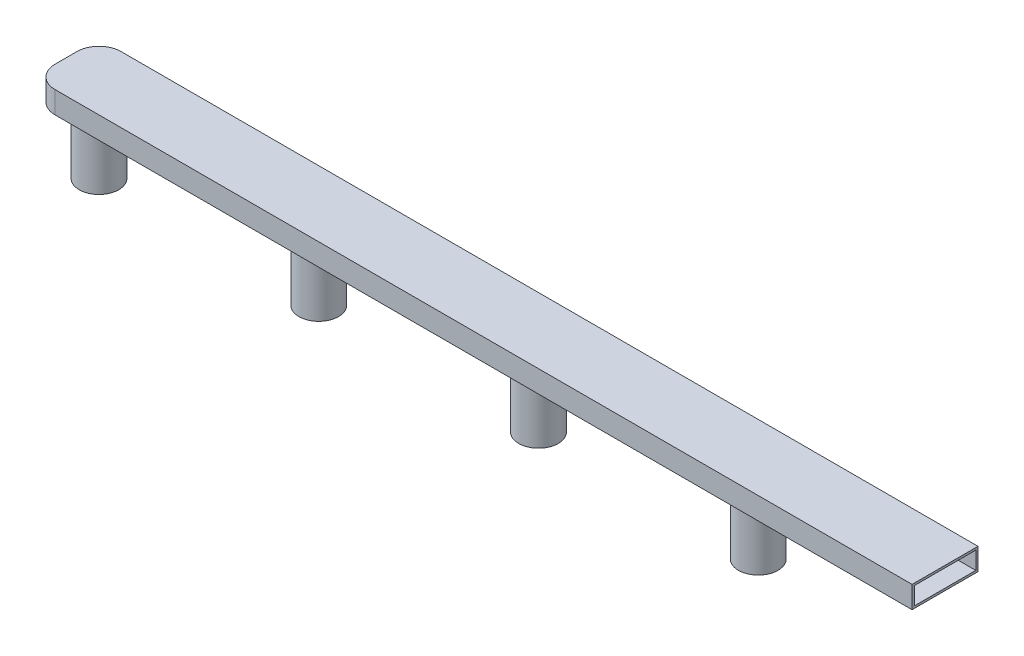
ISO-10303-21;
HEADER;
FILE_DESCRIPTION(('STEP AP214'),'2;1');
FILE_NAME('part.step','',(''),(''),'','','');
FILE_SCHEMA(('AUTOMOTIVE_DESIGN { 1 0 10303 214 1 1 1 1 }'));
ENDSEC;
DATA;
#1=APPLICATION_CONTEXT('core data for automotive mechanical design processes');
#2=APPLICATION_PROTOCOL_DEFINITION('international standard','automotive_design',2000,#1);
#3=PRODUCT_CONTEXT('',#1,'mechanical');
#4=PRODUCT('Part','Part','',(#3));
#5=PRODUCT_RELATED_PRODUCT_CATEGORY('part','',(#4));
#6=PRODUCT_DEFINITION_FORMATION('','',#4);
#7=PRODUCT_DEFINITION_CONTEXT('part definition',#1,'design');
#8=PRODUCT_DEFINITION('design','',#6,#7);
#9=PRODUCT_DEFINITION_SHAPE('','',#8);
#10=(LENGTH_UNIT() NAMED_UNIT(*) SI_UNIT(.MILLI.,.METRE.));
#11=(NAMED_UNIT(*) PLANE_ANGLE_UNIT() SI_UNIT($,.RADIAN.));
#12=(NAMED_UNIT(*) SI_UNIT($,.STERADIAN.) SOLID_ANGLE_UNIT());
#13=UNCERTAINTY_MEASURE_WITH_UNIT(LENGTH_MEASURE(1.E-05),#10,'distance_accuracy_value','');
#14=(GEOMETRIC_REPRESENTATION_CONTEXT(3) GLOBAL_UNCERTAINTY_ASSIGNED_CONTEXT((#13)) GLOBAL_UNIT_ASSIGNED_CONTEXT((#10,
#11,#12)) REPRESENTATION_CONTEXT('',''));
#15=CARTESIAN_POINT('',(0.,0.,0.));
#16=DIRECTION('',(0.,0.,1.));
#17=DIRECTION('',(1.,0.,0.));
#18=AXIS2_PLACEMENT_3D('',#15,#16,#17);
#19=CARTESIAN_POINT('',(235.,10.,-15.));
#20=DIRECTION('',(-1.,0.,0.));
#21=DIRECTION('',(0.,0.,1.));
#22=AXIS2_PLACEMENT_3D('',#19,#20,#21);
#23=PLANE('',#22);
#24=DIRECTION('',(0.,0.,-1.));
#25=VECTOR('',#24,1.);
#26=CARTESIAN_POINT('',(235.,0.,-15.));
#27=LINE('',#26,#25);
#28=CARTESIAN_POINT('',(235.,0.,15.));
#29=VERTEX_POINT('',#28);
#30=CARTESIAN_POINT('',(235.,0.,-15.));
#31=VERTEX_POINT('',#30);
#32=EDGE_CURVE('E151',#29,#31,#27,.T.);
#33=ORIENTED_EDGE('',*,*,#32,.T.);
#34=DIRECTION('',(0.,-1.,0.));
#35=VECTOR('',#34,1.);
#36=CARTESIAN_POINT('',(235.,10.,-15.));
#37=LINE('',#36,#35);
#38=CARTESIAN_POINT('',(235.,10.,-15.));
#39=VERTEX_POINT('',#38);
#40=EDGE_CURVE('E12',#39,#31,#37,.T.);
#41=ORIENTED_EDGE('',*,*,#40,.F.);
#42=DIRECTION('',(0.,0.,-1.));
#43=VECTOR('',#42,1.);
#44=CARTESIAN_POINT('',(235.,10.,-15.));
#45=LINE('',#44,#43);
#46=CARTESIAN_POINT('',(235.,10.,15.));
#47=VERTEX_POINT('',#46);
#48=EDGE_CURVE('E169',#47,#39,#45,.T.);
#49=ORIENTED_EDGE('',*,*,#48,.F.);
#50=DIRECTION('',(0.,-1.,0.));
#51=VECTOR('',#50,1.);
#52=CARTESIAN_POINT('',(235.,10.,15.));
#53=LINE('',#52,#51);
#54=EDGE_CURVE('E147',#47,#29,#53,.T.);
#55=ORIENTED_EDGE('',*,*,#54,.T.);
#56=EDGE_LOOP('',(#33,#41,#49,#55));
#57=FACE_BOUND('',#56,.T.);
#58=DIRECTION('',(0.,0.,-1.));
#59=VECTOR('',#58,1.);
#60=CARTESIAN_POINT('',(235.,0.999999999999999,-15.));
#61=LINE('',#60,#59);
#62=CARTESIAN_POINT('',(235.,1.,14.));
#63=VERTEX_POINT('',#62);
#64=CARTESIAN_POINT('',(235.,1.,-14.));
#65=VERTEX_POINT('',#64);
#66=EDGE_CURVE('E193',#63,#65,#61,.T.);
#67=ORIENTED_EDGE('',*,*,#66,.F.);
#68=DIRECTION('',(0.,-1.,0.));
#69=VECTOR('',#68,1.);
#70=CARTESIAN_POINT('',(235.,10.,14.));
#71=LINE('',#70,#69);
#72=CARTESIAN_POINT('',(235.,9.,14.));
#73=VERTEX_POINT('',#72);
#74=EDGE_CURVE('E199',#73,#63,#71,.T.);
#75=ORIENTED_EDGE('',*,*,#74,.F.);
#76=DIRECTION('',(0.,0.,-1.));
#77=VECTOR('',#76,1.);
#78=CARTESIAN_POINT('',(235.,9.,-15.));
#79=LINE('',#78,#77);
#80=CARTESIAN_POINT('',(235.,9.,-14.));
#81=VERTEX_POINT('',#80);
#82=EDGE_CURVE('E65',#73,#81,#79,.T.);
#83=ORIENTED_EDGE('',*,*,#82,.T.);
#84=DIRECTION('',(0.,-1.,0.));
#85=VECTOR('',#84,1.);
#86=CARTESIAN_POINT('',(235.,10.,-14.));
#87=LINE('',#86,#85);
#88=EDGE_CURVE('E156',#81,#65,#87,.T.);
#89=ORIENTED_EDGE('',*,*,#88,.T.);
#90=EDGE_LOOP('',(#67,#75,#83,#89));
#91=FACE_BOUND('',#90,.T.);
#92=ADVANCED_FACE('F50',(#57,#91),#23,.F.);
#93=CARTESIAN_POINT('',(-155.,10.,-15.));
#94=DIRECTION('',(0.,0.,1.));
#95=DIRECTION('',(1.,0.,0.));
#96=AXIS2_PLACEMENT_3D('',#93,#94,#95);
#97=PLANE('',#96);
#98=DIRECTION('',(-1.,0.,0.));
#99=VECTOR('',#98,1.);
#100=CARTESIAN_POINT('',(-155.,0.,-15.));
#101=LINE('',#100,#99);
#102=CARTESIAN_POINT('',(-155.,0.,-15.));
#103=VERTEX_POINT('',#102);
#104=EDGE_CURVE('E155',#31,#103,#101,.T.);
#105=ORIENTED_EDGE('',*,*,#104,.T.);
#106=DIRECTION('',(0.,-1.,0.));
#107=VECTOR('',#106,1.);
#108=CARTESIAN_POINT('',(-155.,10.,-15.));
#109=LINE('',#108,#107);
#110=CARTESIAN_POINT('',(-155.,10.,-15.));
#111=VERTEX_POINT('',#110);
#112=EDGE_CURVE('E58',#111,#103,#109,.T.);
#113=ORIENTED_EDGE('',*,*,#112,.F.);
#114=DIRECTION('',(-1.,0.,0.));
#115=VECTOR('',#114,1.);
#116=CARTESIAN_POINT('',(-155.,10.,-15.));
#117=LINE('',#116,#115);
#118=EDGE_CURVE('E109',#39,#111,#117,.T.);
#119=ORIENTED_EDGE('',*,*,#118,.F.);
#120=ORIENTED_EDGE('',*,*,#40,.T.);
#121=EDGE_LOOP('',(#105,#113,#119,#120));
#122=FACE_BOUND('',#121,.T.);
#123=ADVANCED_FACE('F303',(#122),#97,.F.);
#124=CARTESIAN_POINT('',(-155.,10.,-5.));
#125=DIRECTION('',(0.,-1.,0.));
#126=DIRECTION('',(0.,0.,-1.));
#127=AXIS2_PLACEMENT_3D('',#124,#125,#126);
#128=CYLINDRICAL_SURFACE('',#127,10.);
#129=CARTESIAN_POINT('',(-155.,0.,-5.));
#130=DIRECTION('',(0.,1.,0.));
#131=DIRECTION('',(0.,0.,1.));
#132=AXIS2_PLACEMENT_3D('',#129,#130,#131);
#133=CIRCLE('',#132,10.);
#134=CARTESIAN_POINT('',(-165.,0.,-5.));
#135=VERTEX_POINT('',#134);
#136=EDGE_CURVE('E159',#103,#135,#133,.T.);
#137=ORIENTED_EDGE('',*,*,#136,.T.);
#138=DIRECTION('',(0.,-1.,0.));
#139=VECTOR('',#138,1.);
#140=CARTESIAN_POINT('',(-165.,10.,-5.));
#141=LINE('',#140,#139);
#142=CARTESIAN_POINT('',(-165.,10.,-5.));
#143=VERTEX_POINT('',#142);
#144=EDGE_CURVE('E140',#143,#135,#141,.T.);
#145=ORIENTED_EDGE('',*,*,#144,.F.);
#146=CARTESIAN_POINT('',(-155.,10.,-5.));
#147=DIRECTION('',(0.,1.,0.));
#148=DIRECTION('',(0.,0.,1.));
#149=AXIS2_PLACEMENT_3D('',#146,#147,#148);
#150=CIRCLE('',#149,10.);
#151=EDGE_CURVE('E126',#111,#143,#150,.T.);
#152=ORIENTED_EDGE('',*,*,#151,.F.);
#153=ORIENTED_EDGE('',*,*,#112,.T.);
#154=EDGE_LOOP('',(#137,#145,#152,#153));
#155=FACE_BOUND('',#154,.T.);
#156=ADVANCED_FACE('F179',(#155),#128,.T.);
#157=CARTESIAN_POINT('',(-165.,10.,-5.));
#158=DIRECTION('',(1.,0.,0.));
#159=DIRECTION('',(0.,0.,-1.));
#160=AXIS2_PLACEMENT_3D('',#157,#158,#159);
#161=PLANE('',#160);
#162=DIRECTION('',(0.,0.,1.));
#163=VECTOR('',#162,1.);
#164=CARTESIAN_POINT('',(-165.,0.,-5.));
#165=LINE('',#164,#163);
#166=CARTESIAN_POINT('',(-165.,0.,5.));
#167=VERTEX_POINT('',#166);
#168=EDGE_CURVE('E136',#135,#167,#165,.T.);
#169=ORIENTED_EDGE('',*,*,#168,.T.);
#170=DIRECTION('',(0.,-1.,0.));
#171=VECTOR('',#170,1.);
#172=CARTESIAN_POINT('',(-165.,10.,5.));
#173=LINE('',#172,#171);
#174=CARTESIAN_POINT('',(-165.,10.,5.));
#175=VERTEX_POINT('',#174);
#176=EDGE_CURVE('E133',#175,#167,#173,.T.);
#177=ORIENTED_EDGE('',*,*,#176,.F.);
#178=DIRECTION('',(0.,0.,1.));
#179=VECTOR('',#178,1.);
#180=CARTESIAN_POINT('',(-165.,10.,-5.));
#181=LINE('',#180,#179);
#182=EDGE_CURVE('E119',#143,#175,#181,.T.);
#183=ORIENTED_EDGE('',*,*,#182,.F.);
#184=ORIENTED_EDGE('',*,*,#144,.T.);
#185=EDGE_LOOP('',(#169,#177,#183,#184));
#186=FACE_BOUND('',#185,.T.);
#187=ADVANCED_FACE('F134',(#186),#161,.F.);
#188=CARTESIAN_POINT('',(-155.,10.,5.));
#189=DIRECTION('',(0.,-1.,0.));
#190=DIRECTION('',(0.,0.,-1.));
#191=AXIS2_PLACEMENT_3D('',#188,#189,#190);
#192=CYLINDRICAL_SURFACE('',#191,10.);
#193=CARTESIAN_POINT('',(-155.,0.,5.));
#194=DIRECTION('',(0.,1.,0.));
#195=DIRECTION('',(0.,0.,1.));
#196=AXIS2_PLACEMENT_3D('',#193,#194,#195);
#197=CIRCLE('',#196,10.);
#198=CARTESIAN_POINT('',(-155.,0.,15.));
#199=VERTEX_POINT('',#198);
#200=EDGE_CURVE('E164',#167,#199,#197,.T.);
#201=ORIENTED_EDGE('',*,*,#200,.T.);
#202=DIRECTION('',(0.,-1.,0.));
#203=VECTOR('',#202,1.);
#204=CARTESIAN_POINT('',(-155.,10.,15.));
#205=LINE('',#204,#203);
#206=CARTESIAN_POINT('',(-155.,10.,15.));
#207=VERTEX_POINT('',#206);
#208=EDGE_CURVE('E141',#207,#199,#205,.T.);
#209=ORIENTED_EDGE('',*,*,#208,.F.);
#210=CARTESIAN_POINT('',(-155.,10.,5.));
#211=DIRECTION('',(0.,1.,0.));
#212=DIRECTION('',(0.,0.,1.));
#213=AXIS2_PLACEMENT_3D('',#210,#211,#212);
#214=CIRCLE('',#213,10.);
#215=EDGE_CURVE('E123',#175,#207,#214,.T.);
#216=ORIENTED_EDGE('',*,*,#215,.F.);
#217=ORIENTED_EDGE('',*,*,#176,.T.);
#218=EDGE_LOOP('',(#201,#209,#216,#217));
#219=FACE_BOUND('',#218,.T.);
#220=ADVANCED_FACE('F143',(#219),#192,.T.);
#221=CARTESIAN_POINT('',(-155.,10.,15.));
#222=DIRECTION('',(0.,0.,-1.));
#223=DIRECTION('',(-1.,0.,0.));
#224=AXIS2_PLACEMENT_3D('',#221,#222,#223);
#225=PLANE('',#224);
#226=DIRECTION('',(1.,0.,0.));
#227=VECTOR('',#226,1.);
#228=CARTESIAN_POINT('',(-155.,0.,15.));
#229=LINE('',#228,#227);
#230=EDGE_CURVE('E101',#199,#29,#229,.T.);
#231=ORIENTED_EDGE('',*,*,#230,.T.);
#232=ORIENTED_EDGE('',*,*,#54,.F.);
#233=DIRECTION('',(1.,0.,0.));
#234=VECTOR('',#233,1.);
#235=CARTESIAN_POINT('',(-155.,10.,15.));
#236=LINE('',#235,#234);
#237=EDGE_CURVE('E74',#207,#47,#236,.T.);
#238=ORIENTED_EDGE('',*,*,#237,.F.);
#239=ORIENTED_EDGE('',*,*,#208,.T.);
#240=EDGE_LOOP('',(#231,#232,#238,#239));
#241=FACE_BOUND('',#240,.T.);
#242=ADVANCED_FACE('F183',(#241),#225,.F.);
#243=CARTESIAN_POINT('',(-155.,10.,5.));
#244=DIRECTION('',(0.,1.,0.));
#245=DIRECTION('',(0.,0.,1.));
#246=AXIS2_PLACEMENT_3D('',#243,#244,#245);
#247=PLANE('',#246);
#248=ORIENTED_EDGE('',*,*,#48,.T.);
#249=ORIENTED_EDGE('',*,*,#118,.T.);
#250=ORIENTED_EDGE('',*,*,#151,.T.);
#251=ORIENTED_EDGE('',*,*,#182,.T.);
#252=ORIENTED_EDGE('',*,*,#215,.T.);
#253=ORIENTED_EDGE('',*,*,#237,.T.);
#254=EDGE_LOOP('',(#248,#249,#250,#251,#252,#253));
#255=FACE_BOUND('',#254,.T.);
#256=ADVANCED_FACE('F121',(#255),#247,.T.);
#257=CARTESIAN_POINT('',(-155.,0.,5.));
#258=DIRECTION('',(0.,1.,0.));
#259=DIRECTION('',(0.,0.,1.));
#260=AXIS2_PLACEMENT_3D('',#257,#258,#259);
#261=PLANE('',#260);
#262=ORIENTED_EDGE('',*,*,#32,.F.);
#263=ORIENTED_EDGE('',*,*,#230,.F.);
#264=ORIENTED_EDGE('',*,*,#200,.F.);
#265=ORIENTED_EDGE('',*,*,#168,.F.);
#266=ORIENTED_EDGE('',*,*,#136,.F.);
#267=ORIENTED_EDGE('',*,*,#104,.F.);
#268=EDGE_LOOP('',(#262,#263,#264,#265,#266,#267));
#269=FACE_BOUND('',#268,.T.);
#270=ADVANCED_FACE('F182',(#269),#261,.F.);
#271=CARTESIAN_POINT('',(-155.,10.,-14.));
#272=DIRECTION('',(0.,0.,1.));
#273=DIRECTION('',(1.,0.,0.));
#274=AXIS2_PLACEMENT_3D('',#271,#272,#273);
#275=PLANE('',#274);
#276=DIRECTION('',(-1.,0.,0.));
#277=VECTOR('',#276,1.);
#278=CARTESIAN_POINT('',(-155.,0.999999999999999,-14.));
#279=LINE('',#278,#277);
#280=CARTESIAN_POINT('',(-155.,0.999999999999999,-14.));
#281=VERTEX_POINT('',#280);
#282=EDGE_CURVE('E198',#65,#281,#279,.T.);
#283=ORIENTED_EDGE('',*,*,#282,.F.);
#284=ORIENTED_EDGE('',*,*,#88,.F.);
#285=DIRECTION('',(-1.,0.,0.));
#286=VECTOR('',#285,1.);
#287=CARTESIAN_POINT('',(-155.,9.,-14.));
#288=LINE('',#287,#286);
#289=CARTESIAN_POINT('',(-155.,9.,-14.));
#290=VERTEX_POINT('',#289);
#291=EDGE_CURVE('E207',#81,#290,#288,.T.);
#292=ORIENTED_EDGE('',*,*,#291,.T.);
#293=DIRECTION('',(0.,-1.,0.));
#294=VECTOR('',#293,1.);
#295=CARTESIAN_POINT('',(-155.,10.,-14.));
#296=LINE('',#295,#294);
#297=EDGE_CURVE('E212',#290,#281,#296,.T.);
#298=ORIENTED_EDGE('',*,*,#297,.T.);
#299=EDGE_LOOP('',(#283,#284,#292,#298));
#300=FACE_BOUND('',#299,.T.);
#301=ADVANCED_FACE('F272',(#300),#275,.T.);
#302=CARTESIAN_POINT('',(-155.,10.,-5.));
#303=DIRECTION('',(0.,-1.,0.));
#304=DIRECTION('',(0.,0.,-1.));
#305=AXIS2_PLACEMENT_3D('',#302,#303,#304);
#306=CYLINDRICAL_SURFACE('',#305,9.00000000000001);
#307=CARTESIAN_POINT('',(-155.,0.999999999999999,-5.));
#308=DIRECTION('',(0.,1.,0.));
#309=DIRECTION('',(0.,0.,1.));
#310=AXIS2_PLACEMENT_3D('',#307,#308,#309);
#311=CIRCLE('',#310,9.00000000000001);
#312=CARTESIAN_POINT('',(-164.,0.999999999999999,-5.));
#313=VERTEX_POINT('',#312);
#314=EDGE_CURVE('E243',#281,#313,#311,.T.);
#315=ORIENTED_EDGE('',*,*,#314,.F.);
#316=ORIENTED_EDGE('',*,*,#297,.F.);
#317=CARTESIAN_POINT('',(-155.,9.,-5.));
#318=DIRECTION('',(0.,1.,0.));
#319=DIRECTION('',(0.,0.,1.));
#320=AXIS2_PLACEMENT_3D('',#317,#318,#319);
#321=CIRCLE('',#320,9.00000000000001);
#322=CARTESIAN_POINT('',(-164.,9.,-5.));
#323=VERTEX_POINT('',#322);
#324=EDGE_CURVE('E235',#290,#323,#321,.T.);
#325=ORIENTED_EDGE('',*,*,#324,.T.);
#326=DIRECTION('',(0.,1.,0.));
#327=VECTOR('',#326,1.);
#328=CARTESIAN_POINT('',(-164.,10.,-5.));
#329=LINE('',#328,#327);
#330=EDGE_CURVE('E239',#323,#313,#329,.F.);
#331=ORIENTED_EDGE('',*,*,#330,.T.);
#332=EDGE_LOOP('',(#315,#316,#325,#331));
#333=FACE_BOUND('',#332,.T.);
#334=ADVANCED_FACE('F276',(#333),#306,.F.);
#335=CARTESIAN_POINT('',(-164.,10.,-5.));
#336=DIRECTION('',(1.,0.,0.));
#337=DIRECTION('',(0.,0.,-1.));
#338=AXIS2_PLACEMENT_3D('',#335,#336,#337);
#339=PLANE('',#338);
#340=DIRECTION('',(0.,0.,1.));
#341=VECTOR('',#340,1.);
#342=CARTESIAN_POINT('',(-164.,0.999999999999999,-5.));
#343=LINE('',#342,#341);
#344=CARTESIAN_POINT('',(-164.,0.999999999999999,5.));
#345=VERTEX_POINT('',#344);
#346=EDGE_CURVE('E231',#313,#345,#343,.T.);
#347=ORIENTED_EDGE('',*,*,#346,.F.);
#348=ORIENTED_EDGE('',*,*,#330,.F.);
#349=DIRECTION('',(0.,0.,1.));
#350=VECTOR('',#349,1.);
#351=CARTESIAN_POINT('',(-164.,9.,-5.));
#352=LINE('',#351,#350);
#353=CARTESIAN_POINT('',(-164.,9.,5.));
#354=VERTEX_POINT('',#353);
#355=EDGE_CURVE('E223',#323,#354,#352,.T.);
#356=ORIENTED_EDGE('',*,*,#355,.T.);
#357=DIRECTION('',(0.,-1.,0.));
#358=VECTOR('',#357,1.);
#359=CARTESIAN_POINT('',(-164.,10.,5.));
#360=LINE('',#359,#358);
#361=EDGE_CURVE('E227',#354,#345,#360,.T.);
#362=ORIENTED_EDGE('',*,*,#361,.T.);
#363=EDGE_LOOP('',(#347,#348,#356,#362));
#364=FACE_BOUND('',#363,.T.);
#365=ADVANCED_FACE('F284',(#364),#339,.T.);
#366=CARTESIAN_POINT('',(-155.,10.,5.));
#367=DIRECTION('',(0.,-1.,0.));
#368=DIRECTION('',(0.,0.,-1.));
#369=AXIS2_PLACEMENT_3D('',#366,#367,#368);
#370=CYLINDRICAL_SURFACE('',#369,9.00000000000001);
#371=CARTESIAN_POINT('',(-155.,0.999999999999999,5.));
#372=DIRECTION('',(0.,1.,0.));
#373=DIRECTION('',(0.,0.,1.));
#374=AXIS2_PLACEMENT_3D('',#371,#372,#373);
#375=CIRCLE('',#374,9.00000000000001);
#376=CARTESIAN_POINT('',(-155.,0.999999999999999,14.));
#377=VERTEX_POINT('',#376);
#378=EDGE_CURVE('E219',#345,#377,#375,.T.);
#379=ORIENTED_EDGE('',*,*,#378,.F.);
#380=ORIENTED_EDGE('',*,*,#361,.F.);
#381=CARTESIAN_POINT('',(-155.,9.,5.));
#382=DIRECTION('',(0.,1.,0.));
#383=DIRECTION('',(0.,0.,1.));
#384=AXIS2_PLACEMENT_3D('',#381,#382,#383);
#385=CIRCLE('',#384,9.00000000000001);
#386=CARTESIAN_POINT('',(-155.,9.,14.));
#387=VERTEX_POINT('',#386);
#388=EDGE_CURVE('E215',#354,#387,#385,.T.);
#389=ORIENTED_EDGE('',*,*,#388,.T.);
#390=DIRECTION('',(0.,1.,0.));
#391=VECTOR('',#390,1.);
#392=CARTESIAN_POINT('',(-155.,10.,14.));
#393=LINE('',#392,#391);
#394=EDGE_CURVE('E203',#387,#377,#393,.F.);
#395=ORIENTED_EDGE('',*,*,#394,.T.);
#396=EDGE_LOOP('',(#379,#380,#389,#395));
#397=FACE_BOUND('',#396,.T.);
#398=ADVANCED_FACE('F329',(#397),#370,.F.);
#399=CARTESIAN_POINT('',(-155.,10.,14.));
#400=DIRECTION('',(0.,0.,-1.));
#401=DIRECTION('',(-1.,0.,0.));
#402=AXIS2_PLACEMENT_3D('',#399,#400,#401);
#403=PLANE('',#402);
#404=DIRECTION('',(1.,0.,0.));
#405=VECTOR('',#404,1.);
#406=CARTESIAN_POINT('',(-155.,0.999999999999999,14.));
#407=LINE('',#406,#405);
#408=EDGE_CURVE('E208',#377,#63,#407,.T.);
#409=ORIENTED_EDGE('',*,*,#408,.F.);
#410=ORIENTED_EDGE('',*,*,#394,.F.);
#411=DIRECTION('',(1.,0.,0.));
#412=VECTOR('',#411,1.);
#413=CARTESIAN_POINT('',(-155.,9.,14.));
#414=LINE('',#413,#412);
#415=EDGE_CURVE('E204',#387,#73,#414,.T.);
#416=ORIENTED_EDGE('',*,*,#415,.T.);
#417=ORIENTED_EDGE('',*,*,#74,.T.);
#418=EDGE_LOOP('',(#409,#410,#416,#417));
#419=FACE_BOUND('',#418,.T.);
#420=ADVANCED_FACE('F301',(#419),#403,.T.);
#421=CARTESIAN_POINT('',(-155.,9.,5.));
#422=DIRECTION('',(0.,1.,0.));
#423=DIRECTION('',(0.,0.,1.));
#424=AXIS2_PLACEMENT_3D('',#421,#422,#423);
#425=PLANE('',#424);
#426=ORIENTED_EDGE('',*,*,#82,.F.);
#427=ORIENTED_EDGE('',*,*,#415,.F.);
#428=ORIENTED_EDGE('',*,*,#388,.F.);
#429=ORIENTED_EDGE('',*,*,#355,.F.);
#430=ORIENTED_EDGE('',*,*,#324,.F.);
#431=ORIENTED_EDGE('',*,*,#291,.F.);
#432=EDGE_LOOP('',(#426,#427,#428,#429,#430,#431));
#433=FACE_BOUND('',#432,.T.);
#434=ADVANCED_FACE('F324',(#433),#425,.F.);
#435=CARTESIAN_POINT('',(-155.,1.,5.));
#436=DIRECTION('',(0.,1.,0.));
#437=DIRECTION('',(0.,0.,1.));
#438=AXIS2_PLACEMENT_3D('',#435,#436,#437);
#439=PLANE('',#438);
#440=ORIENTED_EDGE('',*,*,#66,.T.);
#441=ORIENTED_EDGE('',*,*,#282,.T.);
#442=ORIENTED_EDGE('',*,*,#314,.T.);
#443=ORIENTED_EDGE('',*,*,#346,.T.);
#444=ORIENTED_EDGE('',*,*,#378,.T.);
#445=ORIENTED_EDGE('',*,*,#408,.T.);
#446=EDGE_LOOP('',(#440,#441,#442,#443,#444,#445));
#447=FACE_BOUND('',#446,.T.);
#448=ADVANCED_FACE('F264',(#447),#439,.T.);
#449=CLOSED_SHELL('',(#92,#123,#156,#187,#220,#242,#256,#270,#301,#334,#365,#398,#420,#434,#448));
#450=MANIFOLD_SOLID_BREP('B2',#449);
#451=CARTESIAN_POINT('',(-150.,-30.,0.));
#452=DIRECTION('',(0.,1.,0.));
#453=DIRECTION('',(0.,0.,1.));
#454=AXIS2_PLACEMENT_3D('',#451,#452,#453);
#455=CYLINDRICAL_SURFACE('',#454,9.00000000000001);
#456=CARTESIAN_POINT('',(-150.,-30.,0.));
#457=DIRECTION('',(0.,1.,0.));
#458=DIRECTION('',(0.,0.,1.));
#459=AXIS2_PLACEMENT_3D('',#456,#457,#458);
#460=CIRCLE('',#459,9.00000000000001);
#461=CARTESIAN_POINT('',(-150.,-30.,9.00000000000001));
#462=VERTEX_POINT('',#461);
#463=EDGE_CURVE('E49',#462,#462,#460,.T.);
#464=ORIENTED_EDGE('',*,*,#463,.T.);
#465=EDGE_LOOP('',(#464));
#466=FACE_BOUND('',#465,.T.);
#467=CARTESIAN_POINT('',(-150.,0.,0.));
#468=DIRECTION('',(0.,1.,0.));
#469=DIRECTION('',(0.,0.,1.));
#470=AXIS2_PLACEMENT_3D('',#467,#468,#469);
#471=CIRCLE('',#470,9.00000000000001);
#472=CARTESIAN_POINT('',(-150.,0.,9.00000000000001));
#473=VERTEX_POINT('',#472);
#474=EDGE_CURVE('E440',#473,#473,#471,.T.);
#475=ORIENTED_EDGE('',*,*,#474,.F.);
#476=EDGE_LOOP('',(#475));
#477=FACE_BOUND('',#476,.T.);
#478=ADVANCED_FACE('F437',(#466,#477),#455,.T.);
#479=CARTESIAN_POINT('',(-150.,-30.,0.));
#480=DIRECTION('',(0.,1.,0.));
#481=DIRECTION('',(0.,0.,1.));
#482=AXIS2_PLACEMENT_3D('',#479,#480,#481);
#483=PLANE('',#482);
#484=CARTESIAN_POINT('',(-150.,-30.,0.));
#485=DIRECTION('',(0.,1.,0.));
#486=DIRECTION('',(0.,0.,1.));
#487=AXIS2_PLACEMENT_3D('',#484,#485,#486);
#488=CIRCLE('',#487,6.50000000000002);
#489=CARTESIAN_POINT('',(-150.,-30.,6.50000000000002));
#490=VERTEX_POINT('',#489);
#491=EDGE_CURVE('E447',#490,#490,#488,.T.);
#492=ORIENTED_EDGE('',*,*,#491,.T.);
#493=EDGE_LOOP('',(#492));
#494=FACE_BOUND('',#493,.T.);
#495=ORIENTED_EDGE('',*,*,#463,.F.);
#496=EDGE_LOOP('',(#495));
#497=FACE_BOUND('',#496,.T.);
#498=ADVANCED_FACE('F455',(#494,#497),#483,.F.);
#499=CARTESIAN_POINT('',(-150.,0.,0.));
#500=DIRECTION('',(0.,1.,0.));
#501=DIRECTION('',(0.,0.,1.));
#502=AXIS2_PLACEMENT_3D('',#499,#500,#501);
#503=PLANE('',#502);
#504=CARTESIAN_POINT('',(-150.,0.,0.));
#505=DIRECTION('',(0.,1.,0.));
#506=DIRECTION('',(0.,0.,1.));
#507=AXIS2_PLACEMENT_3D('',#504,#505,#506);
#508=CIRCLE('',#507,6.50000000000002);
#509=CARTESIAN_POINT('',(-150.,0.,6.50000000000002));
#510=VERTEX_POINT('',#509);
#511=EDGE_CURVE('E449',#510,#510,#508,.T.);
#512=ORIENTED_EDGE('',*,*,#511,.F.);
#513=EDGE_LOOP('',(#512));
#514=FACE_BOUND('',#513,.T.);
#515=ORIENTED_EDGE('',*,*,#474,.T.);
#516=EDGE_LOOP('',(#515));
#517=FACE_BOUND('',#516,.T.);
#518=ADVANCED_FACE('F461',(#514,#517),#503,.T.);
#519=CARTESIAN_POINT('',(-150.,-30.,0.));
#520=DIRECTION('',(0.,1.,0.));
#521=DIRECTION('',(0.,0.,1.));
#522=AXIS2_PLACEMENT_3D('',#519,#520,#521);
#523=CYLINDRICAL_SURFACE('',#522,6.50000000000002);
#524=ORIENTED_EDGE('',*,*,#491,.F.);
#525=EDGE_LOOP('',(#524));
#526=FACE_BOUND('',#525,.T.);
#527=ORIENTED_EDGE('',*,*,#511,.T.);
#528=EDGE_LOOP('',(#527));
#529=FACE_BOUND('',#528,.T.);
#530=ADVANCED_FACE('F458',(#526,#529),#523,.F.);
#531=CLOSED_SHELL('',(#478,#498,#518,#530));
#532=MANIFOLD_SOLID_BREP('B6',#531);
#533=CARTESIAN_POINT('',(150.,-30.,0.));
#534=DIRECTION('',(0.,1.,0.));
#535=DIRECTION('',(0.,0.,1.));
#536=AXIS2_PLACEMENT_3D('',#533,#534,#535);
#537=CYLINDRICAL_SURFACE('',#536,9.00000000000001);
#538=CARTESIAN_POINT('',(150.,-30.,0.));
#539=DIRECTION('',(0.,1.,0.));
#540=DIRECTION('',(0.,0.,1.));
#541=AXIS2_PLACEMENT_3D('',#538,#539,#540);
#542=CIRCLE('',#541,9.00000000000001);
#543=CARTESIAN_POINT('',(150.,-30.,9.00000000000001));
#544=VERTEX_POINT('',#543);
#545=EDGE_CURVE('E436',#544,#544,#542,.T.);
#546=ORIENTED_EDGE('',*,*,#545,.T.);
#547=EDGE_LOOP('',(#546));
#548=FACE_BOUND('',#547,.T.);
#549=CARTESIAN_POINT('',(150.,0.,0.));
#550=DIRECTION('',(0.,1.,0.));
#551=DIRECTION('',(0.,0.,1.));
#552=AXIS2_PLACEMENT_3D('',#549,#550,#551);
#553=CIRCLE('',#552,9.00000000000001);
#554=CARTESIAN_POINT('',(150.,0.,9.00000000000001));
#555=VERTEX_POINT('',#554);
#556=EDGE_CURVE('E510',#555,#555,#553,.T.);
#557=ORIENTED_EDGE('',*,*,#556,.F.);
#558=EDGE_LOOP('',(#557));
#559=FACE_BOUND('',#558,.T.);
#560=ADVANCED_FACE('F507',(#548,#559),#537,.T.);
#561=CARTESIAN_POINT('',(150.,-30.,0.));
#562=DIRECTION('',(0.,1.,0.));
#563=DIRECTION('',(0.,0.,1.));
#564=AXIS2_PLACEMENT_3D('',#561,#562,#563);
#565=PLANE('',#564);
#566=CARTESIAN_POINT('',(150.,-30.,0.));
#567=DIRECTION('',(0.,1.,0.));
#568=DIRECTION('',(0.,0.,1.));
#569=AXIS2_PLACEMENT_3D('',#566,#567,#568);
#570=CIRCLE('',#569,6.50000000000002);
#571=CARTESIAN_POINT('',(150.,-30.,6.50000000000002));
#572=VERTEX_POINT('',#571);
#573=EDGE_CURVE('E517',#572,#572,#570,.T.);
#574=ORIENTED_EDGE('',*,*,#573,.T.);
#575=EDGE_LOOP('',(#574));
#576=FACE_BOUND('',#575,.T.);
#577=ORIENTED_EDGE('',*,*,#545,.F.);
#578=EDGE_LOOP('',(#577));
#579=FACE_BOUND('',#578,.T.);
#580=ADVANCED_FACE('F525',(#576,#579),#565,.F.);
#581=CARTESIAN_POINT('',(150.,0.,0.));
#582=DIRECTION('',(0.,1.,0.));
#583=DIRECTION('',(0.,0.,1.));
#584=AXIS2_PLACEMENT_3D('',#581,#582,#583);
#585=PLANE('',#584);
#586=CARTESIAN_POINT('',(150.,0.,0.));
#587=DIRECTION('',(0.,1.,0.));
#588=DIRECTION('',(0.,0.,1.));
#589=AXIS2_PLACEMENT_3D('',#586,#587,#588);
#590=CIRCLE('',#589,6.50000000000002);
#591=CARTESIAN_POINT('',(150.,0.,6.50000000000002));
#592=VERTEX_POINT('',#591);
#593=EDGE_CURVE('E519',#592,#592,#590,.T.);
#594=ORIENTED_EDGE('',*,*,#593,.F.);
#595=EDGE_LOOP('',(#594));
#596=FACE_BOUND('',#595,.T.);
#597=ORIENTED_EDGE('',*,*,#556,.T.);
#598=EDGE_LOOP('',(#597));
#599=FACE_BOUND('',#598,.T.);
#600=ADVANCED_FACE('F531',(#596,#599),#585,.T.);
#601=CARTESIAN_POINT('',(150.,-30.,0.));
#602=DIRECTION('',(0.,1.,0.));
#603=DIRECTION('',(0.,0.,1.));
#604=AXIS2_PLACEMENT_3D('',#601,#602,#603);
#605=CYLINDRICAL_SURFACE('',#604,6.50000000000002);
#606=ORIENTED_EDGE('',*,*,#573,.F.);
#607=EDGE_LOOP('',(#606));
#608=FACE_BOUND('',#607,.T.);
#609=ORIENTED_EDGE('',*,*,#593,.T.);
#610=EDGE_LOOP('',(#609));
#611=FACE_BOUND('',#610,.T.);
#612=ADVANCED_FACE('F528',(#608,#611),#605,.F.);
#613=CLOSED_SHELL('',(#560,#580,#600,#612));
#614=MANIFOLD_SOLID_BREP('B44',#613);
#615=CARTESIAN_POINT('',(50.,-30.,0.));
#616=DIRECTION('',(0.,1.,0.));
#617=DIRECTION('',(0.,0.,1.));
#618=AXIS2_PLACEMENT_3D('',#615,#616,#617);
#619=CYLINDRICAL_SURFACE('',#618,9.);
#620=CARTESIAN_POINT('',(50.,-30.,0.));
#621=DIRECTION('',(0.,1.,0.));
#622=DIRECTION('',(0.,0.,1.));
#623=AXIS2_PLACEMENT_3D('',#620,#621,#622);
#624=CIRCLE('',#623,9.);
#625=CARTESIAN_POINT('',(50.,-30.,9.));
#626=VERTEX_POINT('',#625);
#627=EDGE_CURVE('E506',#626,#626,#624,.T.);
#628=ORIENTED_EDGE('',*,*,#627,.T.);
#629=EDGE_LOOP('',(#628));
#630=FACE_BOUND('',#629,.T.);
#631=CARTESIAN_POINT('',(50.,0.,0.));
#632=DIRECTION('',(0.,1.,0.));
#633=DIRECTION('',(0.,0.,1.));
#634=AXIS2_PLACEMENT_3D('',#631,#632,#633);
#635=CIRCLE('',#634,9.);
#636=CARTESIAN_POINT('',(50.,0.,9.));
#637=VERTEX_POINT('',#636);
#638=EDGE_CURVE('E579',#637,#637,#635,.T.);
#639=ORIENTED_EDGE('',*,*,#638,.F.);
#640=EDGE_LOOP('',(#639));
#641=FACE_BOUND('',#640,.T.);
#642=ADVANCED_FACE('F576',(#630,#641),#619,.T.);
#643=CARTESIAN_POINT('',(50.,-30.,0.));
#644=DIRECTION('',(0.,1.,0.));
#645=DIRECTION('',(0.,0.,1.));
#646=AXIS2_PLACEMENT_3D('',#643,#644,#645);
#647=PLANE('',#646);
#648=CARTESIAN_POINT('',(50.,-30.,0.));
#649=DIRECTION('',(0.,1.,0.));
#650=DIRECTION('',(0.,0.,1.));
#651=AXIS2_PLACEMENT_3D('',#648,#649,#650);
#652=CIRCLE('',#651,6.5);
#653=CARTESIAN_POINT('',(50.,-30.,6.5));
#654=VERTEX_POINT('',#653);
#655=EDGE_CURVE('E586',#654,#654,#652,.T.);
#656=ORIENTED_EDGE('',*,*,#655,.T.);
#657=EDGE_LOOP('',(#656));
#658=FACE_BOUND('',#657,.T.);
#659=ORIENTED_EDGE('',*,*,#627,.F.);
#660=EDGE_LOOP('',(#659));
#661=FACE_BOUND('',#660,.T.);
#662=ADVANCED_FACE('F594',(#658,#661),#647,.F.);
#663=CARTESIAN_POINT('',(50.,0.,0.));
#664=DIRECTION('',(0.,1.,0.));
#665=DIRECTION('',(0.,0.,1.));
#666=AXIS2_PLACEMENT_3D('',#663,#664,#665);
#667=PLANE('',#666);
#668=CARTESIAN_POINT('',(50.,0.,0.));
#669=DIRECTION('',(0.,1.,0.));
#670=DIRECTION('',(0.,0.,1.));
#671=AXIS2_PLACEMENT_3D('',#668,#669,#670);
#672=CIRCLE('',#671,6.5);
#673=CARTESIAN_POINT('',(50.,0.,6.5));
#674=VERTEX_POINT('',#673);
#675=EDGE_CURVE('E588',#674,#674,#672,.T.);
#676=ORIENTED_EDGE('',*,*,#675,.F.);
#677=EDGE_LOOP('',(#676));
#678=FACE_BOUND('',#677,.T.);
#679=ORIENTED_EDGE('',*,*,#638,.T.);
#680=EDGE_LOOP('',(#679));
#681=FACE_BOUND('',#680,.T.);
#682=ADVANCED_FACE('F600',(#678,#681),#667,.T.);
#683=CARTESIAN_POINT('',(50.,-30.,0.));
#684=DIRECTION('',(0.,1.,0.));
#685=DIRECTION('',(0.,0.,1.));
#686=AXIS2_PLACEMENT_3D('',#683,#684,#685);
#687=CYLINDRICAL_SURFACE('',#686,6.5);
#688=ORIENTED_EDGE('',*,*,#655,.F.);
#689=EDGE_LOOP('',(#688));
#690=FACE_BOUND('',#689,.T.);
#691=ORIENTED_EDGE('',*,*,#675,.T.);
#692=EDGE_LOOP('',(#691));
#693=FACE_BOUND('',#692,.T.);
#694=ADVANCED_FACE('F597',(#690,#693),#687,.F.);
#695=CLOSED_SHELL('',(#642,#662,#682,#694));
#696=MANIFOLD_SOLID_BREP('B431',#695);
#697=CARTESIAN_POINT('',(-50.,-30.,0.));
#698=DIRECTION('',(0.,1.,0.));
#699=DIRECTION('',(0.,0.,1.));
#700=AXIS2_PLACEMENT_3D('',#697,#698,#699);
#701=CYLINDRICAL_SURFACE('',#700,9.);
#702=CARTESIAN_POINT('',(-50.,-30.,0.));
#703=DIRECTION('',(0.,1.,0.));
#704=DIRECTION('',(0.,0.,1.));
#705=AXIS2_PLACEMENT_3D('',#702,#703,#704);
#706=CIRCLE('',#705,9.);
#707=CARTESIAN_POINT('',(-50.,-30.,9.));
#708=VERTEX_POINT('',#707);
#709=EDGE_CURVE('E575',#708,#708,#706,.T.);
#710=ORIENTED_EDGE('',*,*,#709,.T.);
#711=EDGE_LOOP('',(#710));
#712=FACE_BOUND('',#711,.T.);
#713=CARTESIAN_POINT('',(-50.,0.,0.));
#714=DIRECTION('',(0.,1.,0.));
#715=DIRECTION('',(0.,0.,1.));
#716=AXIS2_PLACEMENT_3D('',#713,#714,#715);
#717=CIRCLE('',#716,9.);
#718=CARTESIAN_POINT('',(-50.,0.,9.));
#719=VERTEX_POINT('',#718);
#720=EDGE_CURVE('E641',#719,#719,#717,.T.);
#721=ORIENTED_EDGE('',*,*,#720,.F.);
#722=EDGE_LOOP('',(#721));
#723=FACE_BOUND('',#722,.T.);
#724=ADVANCED_FACE('F638',(#712,#723),#701,.T.);
#725=CARTESIAN_POINT('',(-50.,-30.,0.));
#726=DIRECTION('',(0.,1.,0.));
#727=DIRECTION('',(0.,0.,1.));
#728=AXIS2_PLACEMENT_3D('',#725,#726,#727);
#729=PLANE('',#728);
#730=CARTESIAN_POINT('',(-50.,-30.,0.));
#731=DIRECTION('',(0.,1.,0.));
#732=DIRECTION('',(0.,0.,1.));
#733=AXIS2_PLACEMENT_3D('',#730,#731,#732);
#734=CIRCLE('',#733,6.5);
#735=CARTESIAN_POINT('',(-50.,-30.,6.5));
#736=VERTEX_POINT('',#735);
#737=EDGE_CURVE('E648',#736,#736,#734,.T.);
#738=ORIENTED_EDGE('',*,*,#737,.T.);
#739=EDGE_LOOP('',(#738));
#740=FACE_BOUND('',#739,.T.);
#741=ORIENTED_EDGE('',*,*,#709,.F.);
#742=EDGE_LOOP('',(#741));
#743=FACE_BOUND('',#742,.T.);
#744=ADVANCED_FACE('F656',(#740,#743),#729,.F.);
#745=CARTESIAN_POINT('',(-50.,0.,0.));
#746=DIRECTION('',(0.,1.,0.));
#747=DIRECTION('',(0.,0.,1.));
#748=AXIS2_PLACEMENT_3D('',#745,#746,#747);
#749=PLANE('',#748);
#750=CARTESIAN_POINT('',(-50.,0.,0.));
#751=DIRECTION('',(0.,1.,0.));
#752=DIRECTION('',(0.,0.,1.));
#753=AXIS2_PLACEMENT_3D('',#750,#751,#752);
#754=CIRCLE('',#753,6.5);
#755=CARTESIAN_POINT('',(-50.,0.,6.5));
#756=VERTEX_POINT('',#755);
#757=EDGE_CURVE('E650',#756,#756,#754,.T.);
#758=ORIENTED_EDGE('',*,*,#757,.F.);
#759=EDGE_LOOP('',(#758));
#760=FACE_BOUND('',#759,.T.);
#761=ORIENTED_EDGE('',*,*,#720,.T.);
#762=EDGE_LOOP('',(#761));
#763=FACE_BOUND('',#762,.T.);
#764=ADVANCED_FACE('F662',(#760,#763),#749,.T.);
#765=CARTESIAN_POINT('',(-50.,-30.,0.));
#766=DIRECTION('',(0.,1.,0.));
#767=DIRECTION('',(0.,0.,1.));
#768=AXIS2_PLACEMENT_3D('',#765,#766,#767);
#769=CYLINDRICAL_SURFACE('',#768,6.5);
#770=ORIENTED_EDGE('',*,*,#737,.F.);
#771=EDGE_LOOP('',(#770));
#772=FACE_BOUND('',#771,.T.);
#773=ORIENTED_EDGE('',*,*,#757,.T.);
#774=EDGE_LOOP('',(#773));
#775=FACE_BOUND('',#774,.T.);
#776=ADVANCED_FACE('F659',(#772,#775),#769,.F.);
#777=CLOSED_SHELL('',(#724,#744,#764,#776));
#778=MANIFOLD_SOLID_BREP('B501',#777);
#779=ADVANCED_BREP_SHAPE_REPRESENTATION('',(#18,#450,#532,#614,#696,#778),#14);
#780=SHAPE_DEFINITION_REPRESENTATION(#9,#779);
ENDSEC;
END-ISO-10303-21;
